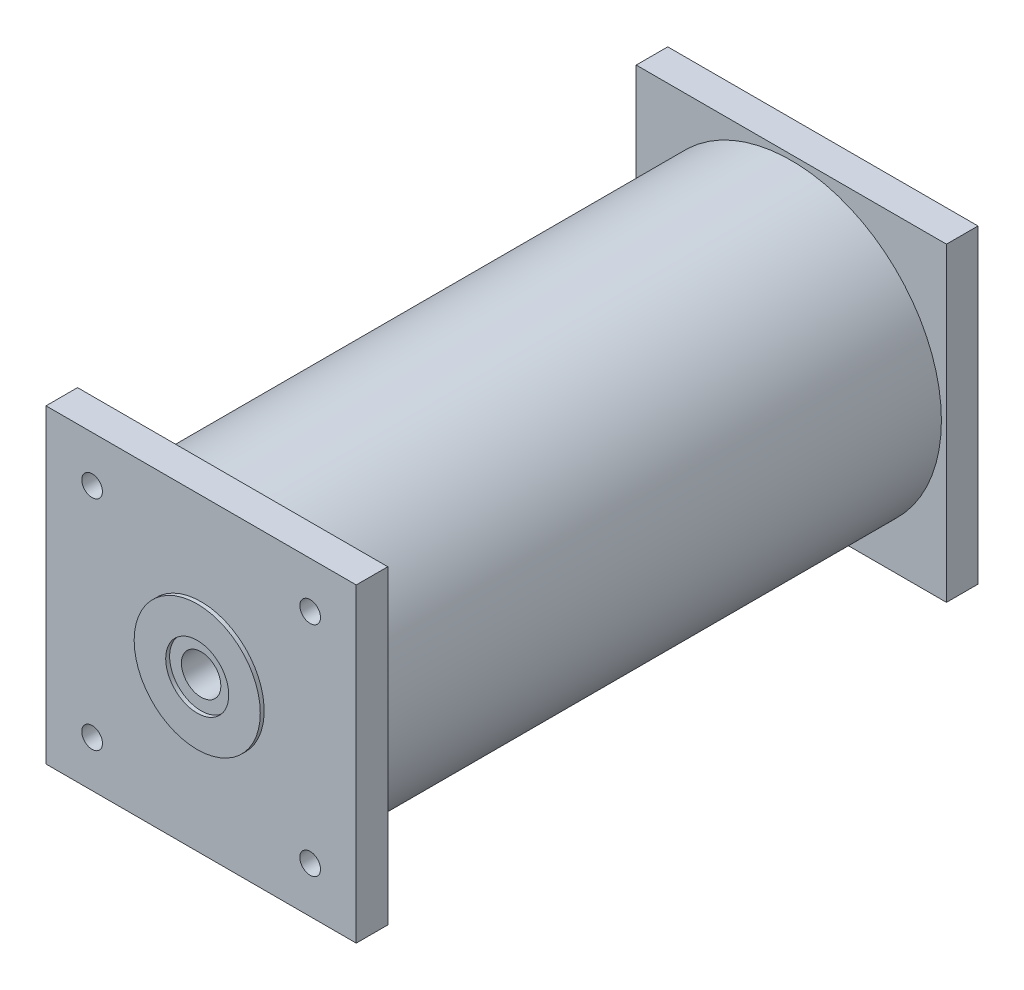
ISO-10303-21;
HEADER;
FILE_DESCRIPTION(('STEP AP214'),'2;1');
FILE_NAME('part.step','',(''),(''),'','','');
FILE_SCHEMA(('AUTOMOTIVE_DESIGN { 1 0 10303 214 1 1 1 1 }'));
ENDSEC;
DATA;
#1=APPLICATION_CONTEXT('core data for automotive mechanical design processes');
#2=APPLICATION_PROTOCOL_DEFINITION('international standard','automotive_design',2000,#1);
#3=PRODUCT_CONTEXT('',#1,'mechanical');
#4=PRODUCT('Part','Part','',(#3));
#5=PRODUCT_RELATED_PRODUCT_CATEGORY('part','',(#4));
#6=PRODUCT_DEFINITION_FORMATION('','',#4);
#7=PRODUCT_DEFINITION_CONTEXT('part definition',#1,'design');
#8=PRODUCT_DEFINITION('design','',#6,#7);
#9=PRODUCT_DEFINITION_SHAPE('','',#8);
#10=(LENGTH_UNIT() NAMED_UNIT(*) SI_UNIT(.MILLI.,.METRE.));
#11=(NAMED_UNIT(*) PLANE_ANGLE_UNIT() SI_UNIT($,.RADIAN.));
#12=(NAMED_UNIT(*) SI_UNIT($,.STERADIAN.) SOLID_ANGLE_UNIT());
#13=UNCERTAINTY_MEASURE_WITH_UNIT(LENGTH_MEASURE(1.E-05),#10,'distance_accuracy_value','');
#14=(GEOMETRIC_REPRESENTATION_CONTEXT(3) GLOBAL_UNCERTAINTY_ASSIGNED_CONTEXT((#13)) GLOBAL_UNIT_ASSIGNED_CONTEXT((#10,
#11,#12)) REPRESENTATION_CONTEXT('',''));
#15=CARTESIAN_POINT('',(0.,0.,0.));
#16=DIRECTION('',(0.,0.,1.));
#17=DIRECTION('',(1.,0.,0.));
#18=AXIS2_PLACEMENT_3D('',#15,#16,#17);
#19=CARTESIAN_POINT('',(-1.11022302462516E-13,0.,17.5882511339746));
#20=DIRECTION('',(0.,0.,1.));
#21=DIRECTION('',(1.,0.,0.));
#22=AXIS2_PLACEMENT_3D('',#19,#20,#21);
#23=CYLINDRICAL_SURFACE('',#22,30.225);
#24=CARTESIAN_POINT('',(1.11022302462516E-13,0.,-112.522));
#25=DIRECTION('',(0.,0.,1.));
#26=DIRECTION('',(1.,0.,0.));
#27=AXIS2_PLACEMENT_3D('',#24,#25,#26);
#28=CIRCLE('',#27,30.225);
#29=CARTESIAN_POINT('',(30.2250000000001,0.,-112.522));
#30=VERTEX_POINT('',#29);
#31=EDGE_CURVE('E166',#30,#30,#28,.T.);
#32=ORIENTED_EDGE('',*,*,#31,.T.);
#33=EDGE_LOOP('',(#32));
#34=FACE_BOUND('',#33,.T.);
#35=CARTESIAN_POINT('',(0.,0.,0.));
#36=DIRECTION('',(0.,0.,1.));
#37=DIRECTION('',(1.,0.,0.));
#38=AXIS2_PLACEMENT_3D('',#35,#36,#37);
#39=CIRCLE('',#38,30.225);
#40=CARTESIAN_POINT('',(19.9983707978787,-22.6630931346662,0.));
#41=VERTEX_POINT('',#40);
#42=CARTESIAN_POINT('',(22.6630931346659,-19.9983707978787,0.));
#43=VERTEX_POINT('',#42);
#44=EDGE_CURVE('E158',#41,#43,#39,.T.);
#45=ORIENTED_EDGE('',*,*,#44,.F.);
#46=CARTESIAN_POINT('',(-19.9983707978787,-22.6630931346662,0.));
#47=VERTEX_POINT('',#46);
#48=EDGE_CURVE('E163',#47,#41,#39,.T.);
#49=ORIENTED_EDGE('',*,*,#48,.F.);
#50=CARTESIAN_POINT('',(-22.6630931346664,-19.9983707978788,0.));
#51=VERTEX_POINT('',#50);
#52=EDGE_CURVE('E302',#51,#47,#39,.T.);
#53=ORIENTED_EDGE('',*,*,#52,.F.);
#54=CARTESIAN_POINT('',(-22.6630931346662,19.9983707978787,0.));
#55=VERTEX_POINT('',#54);
#56=EDGE_CURVE('E148',#55,#51,#39,.T.);
#57=ORIENTED_EDGE('',*,*,#56,.F.);
#58=CARTESIAN_POINT('',(-19.9983707978788,22.6630931346661,0.));
#59=VERTEX_POINT('',#58);
#60=EDGE_CURVE('E130',#59,#55,#39,.T.);
#61=ORIENTED_EDGE('',*,*,#60,.F.);
#62=CARTESIAN_POINT('',(19.9983707978787,22.6630931346661,0.));
#63=VERTEX_POINT('',#62);
#64=EDGE_CURVE('E146',#63,#59,#39,.T.);
#65=ORIENTED_EDGE('',*,*,#64,.F.);
#66=CARTESIAN_POINT('',(22.6630931346661,19.9983707978787,0.));
#67=VERTEX_POINT('',#66);
#68=EDGE_CURVE('E155',#67,#63,#39,.T.);
#69=ORIENTED_EDGE('',*,*,#68,.F.);
#70=EDGE_CURVE('E157',#43,#67,#39,.T.);
#71=ORIENTED_EDGE('',*,*,#70,.F.);
#72=EDGE_LOOP('',(#45,#49,#53,#57,#61,#65,#69,#71));
#73=FACE_BOUND('',#72,.T.);
#74=ADVANCED_FACE('F43',(#34,#73),#23,.T.);
#75=CARTESIAN_POINT('',(-1.11022302462516E-13,0.,6.35000000000005));
#76=DIRECTION('',(0.,0.,-1.));
#77=DIRECTION('',(-1.,0.,0.));
#78=AXIS2_PLACEMENT_3D('',#75,#76,#77);
#79=PLANE('',#78);
#80=CARTESIAN_POINT('',(-21.9583,-21.9583,6.34999999999997));
#81=DIRECTION('',(0.,0.,1.));
#82=DIRECTION('',(1.,0.,0.));
#83=AXIS2_PLACEMENT_3D('',#80,#81,#82);
#84=CIRCLE('',#83,2.0828);
#85=CARTESIAN_POINT('',(-19.8755,-21.9583,6.34999999999997));
#86=VERTEX_POINT('',#85);
#87=EDGE_CURVE('E196',#86,#86,#84,.T.);
#88=ORIENTED_EDGE('',*,*,#87,.F.);
#89=EDGE_LOOP('',(#88));
#90=FACE_BOUND('',#89,.T.);
#91=CARTESIAN_POINT('',(21.9583,21.9582999999999,6.34999999999994));
#92=DIRECTION('',(0.,0.,1.));
#93=DIRECTION('',(1.,0.,0.));
#94=AXIS2_PLACEMENT_3D('',#91,#92,#93);
#95=CIRCLE('',#94,2.0828);
#96=CARTESIAN_POINT('',(24.0411,21.9582999999999,6.34999999999994));
#97=VERTEX_POINT('',#96);
#98=EDGE_CURVE('E141',#97,#97,#95,.T.);
#99=ORIENTED_EDGE('',*,*,#98,.F.);
#100=EDGE_LOOP('',(#99));
#101=FACE_BOUND('',#100,.T.);
#102=CARTESIAN_POINT('',(-21.9583,21.9582999999999,6.34999999999991));
#103=DIRECTION('',(0.,0.,1.));
#104=DIRECTION('',(1.,0.,0.));
#105=AXIS2_PLACEMENT_3D('',#102,#103,#104);
#106=CIRCLE('',#105,2.0828);
#107=CARTESIAN_POINT('',(-19.8755,21.9582999999999,6.34999999999991));
#108=VERTEX_POINT('',#107);
#109=EDGE_CURVE('E133',#108,#108,#106,.T.);
#110=ORIENTED_EDGE('',*,*,#109,.F.);
#111=EDGE_LOOP('',(#110));
#112=FACE_BOUND('',#111,.T.);
#113=CARTESIAN_POINT('',(21.9583,-21.9583,6.34999999999999));
#114=DIRECTION('',(0.,0.,1.));
#115=DIRECTION('',(1.,0.,0.));
#116=AXIS2_PLACEMENT_3D('',#113,#114,#115);
#117=CIRCLE('',#116,2.0828);
#118=CARTESIAN_POINT('',(24.0411,-21.9583,6.34999999999999));
#119=VERTEX_POINT('',#118);
#120=EDGE_CURVE('E188',#119,#119,#117,.T.);
#121=ORIENTED_EDGE('',*,*,#120,.F.);
#122=EDGE_LOOP('',(#121));
#123=FACE_BOUND('',#122,.T.);
#124=CARTESIAN_POINT('',(-1.11022302462516E-13,0.,6.35000000000005));
#125=DIRECTION('',(0.,0.,-1.));
#126=DIRECTION('',(-1.,0.,0.));
#127=AXIS2_PLACEMENT_3D('',#124,#125,#126);
#128=CIRCLE('',#127,12.7);
#129=CARTESIAN_POINT('',(-12.7000000000001,0.,6.35000000000005));
#130=VERTEX_POINT('',#129);
#131=EDGE_CURVE('E162',#130,#130,#128,.F.);
#132=ORIENTED_EDGE('',*,*,#131,.F.);
#133=EDGE_LOOP('',(#132));
#134=FACE_BOUND('',#133,.T.);
#135=DIRECTION('',(0.,1.,0.));
#136=VECTOR('',#135,1.);
#137=CARTESIAN_POINT('',(31.2419999999999,-31.2420000000001,6.34999999999988));
#138=LINE('',#137,#136);
#139=CARTESIAN_POINT('',(31.2419999999999,-31.2420000000001,6.34999999999988));
#140=VERTEX_POINT('',#139);
#141=CARTESIAN_POINT('',(31.242,31.242,6.34999999999997));
#142=VERTEX_POINT('',#141);
#143=EDGE_CURVE('E271',#140,#142,#138,.T.);
#144=ORIENTED_EDGE('',*,*,#143,.T.);
#145=DIRECTION('',(-1.,0.,0.));
#146=VECTOR('',#145,1.);
#147=CARTESIAN_POINT('',(-31.2420000000001,31.242,6.34999999999997));
#148=LINE('',#147,#146);
#149=CARTESIAN_POINT('',(-31.2420000000001,31.242,6.34999999999997));
#150=VERTEX_POINT('',#149);
#151=EDGE_CURVE('E274',#142,#150,#148,.T.);
#152=ORIENTED_EDGE('',*,*,#151,.T.);
#153=DIRECTION('',(0.,-1.,0.));
#154=VECTOR('',#153,1.);
#155=CARTESIAN_POINT('',(-31.2420000000003,-31.2420000000001,6.34999999999999));
#156=LINE('',#155,#154);
#157=CARTESIAN_POINT('',(-31.2420000000003,-31.2420000000001,6.34999999999999));
#158=VERTEX_POINT('',#157);
#159=EDGE_CURVE('E277',#150,#158,#156,.T.);
#160=ORIENTED_EDGE('',*,*,#159,.T.);
#161=DIRECTION('',(1.,0.,0.));
#162=VECTOR('',#161,1.);
#163=CARTESIAN_POINT('',(-31.2420000000003,-31.2420000000001,6.34999999999999));
#164=LINE('',#163,#162);
#165=EDGE_CURVE('E279',#158,#140,#164,.T.);
#166=ORIENTED_EDGE('',*,*,#165,.T.);
#167=EDGE_LOOP('',(#144,#152,#160,#166));
#168=FACE_BOUND('',#167,.T.);
#169=ADVANCED_FACE('F313',(#90,#101,#112,#123,#134,#168),#79,.F.);
#170=CARTESIAN_POINT('',(0.,0.,0.));
#171=DIRECTION('',(0.,0.,-1.));
#172=DIRECTION('',(-1.,0.,0.));
#173=AXIS2_PLACEMENT_3D('',#170,#171,#172);
#174=PLANE('',#173);
#175=CARTESIAN_POINT('',(-21.9583,-21.9583,0.));
#176=DIRECTION('',(0.,0.,1.));
#177=DIRECTION('',(1.,0.,0.));
#178=AXIS2_PLACEMENT_3D('',#175,#176,#177);
#179=CIRCLE('',#178,2.0828);
#180=EDGE_CURVE('E208',#51,#47,#179,.T.);
#181=ORIENTED_EDGE('',*,*,#180,.T.);
#182=ORIENTED_EDGE('',*,*,#48,.T.);
#183=CARTESIAN_POINT('',(21.9582999999998,-21.9582999999999,0.));
#184=DIRECTION('',(0.,0.,-1.));
#185=DIRECTION('',(-1.,0.,0.));
#186=AXIS2_PLACEMENT_3D('',#183,#184,#185);
#187=CIRCLE('',#186,2.0828);
#188=EDGE_CURVE('E50',#43,#41,#187,.T.);
#189=ORIENTED_EDGE('',*,*,#188,.F.);
#190=ORIENTED_EDGE('',*,*,#70,.T.);
#191=CARTESIAN_POINT('',(21.9583,21.9582999999999,0.));
#192=DIRECTION('',(0.,0.,-1.));
#193=DIRECTION('',(-1.,0.,0.));
#194=AXIS2_PLACEMENT_3D('',#191,#192,#193);
#195=CIRCLE('',#194,2.0828);
#196=EDGE_CURVE('E11',#63,#67,#195,.T.);
#197=ORIENTED_EDGE('',*,*,#196,.F.);
#198=ORIENTED_EDGE('',*,*,#64,.T.);
#199=CARTESIAN_POINT('',(-21.9583,21.9583,0.));
#200=DIRECTION('',(0.,0.,1.));
#201=DIRECTION('',(1.,0.,0.));
#202=AXIS2_PLACEMENT_3D('',#199,#200,#201);
#203=CIRCLE('',#202,2.0828);
#204=EDGE_CURVE('E132',#59,#55,#203,.T.);
#205=ORIENTED_EDGE('',*,*,#204,.T.);
#206=ORIENTED_EDGE('',*,*,#56,.T.);
#207=EDGE_LOOP('',(#181,#182,#189,#190,#197,#198,#205,#206));
#208=FACE_BOUND('',#207,.T.);
#209=DIRECTION('',(0.,1.,0.));
#210=VECTOR('',#209,1.);
#211=CARTESIAN_POINT('',(31.2419999999999,-31.242,-1.38777878078145E-13));
#212=LINE('',#211,#210);
#213=CARTESIAN_POINT('',(31.2419999999999,-31.242,-1.38777878078145E-13));
#214=VERTEX_POINT('',#213);
#215=CARTESIAN_POINT('',(31.242,31.242,0.));
#216=VERTEX_POINT('',#215);
#217=EDGE_CURVE('E268',#214,#216,#212,.T.);
#218=ORIENTED_EDGE('',*,*,#217,.F.);
#219=DIRECTION('',(1.,0.,0.));
#220=VECTOR('',#219,1.);
#221=CARTESIAN_POINT('',(-31.2420000000001,-31.2420000000001,0.));
#222=LINE('',#221,#220);
#223=CARTESIAN_POINT('',(-31.2420000000001,-31.2420000000001,0.));
#224=VERTEX_POINT('',#223);
#225=EDGE_CURVE('E275',#224,#214,#222,.T.);
#226=ORIENTED_EDGE('',*,*,#225,.F.);
#227=DIRECTION('',(0.,-1.,0.));
#228=VECTOR('',#227,1.);
#229=CARTESIAN_POINT('',(-31.2420000000001,-31.2420000000001,0.));
#230=LINE('',#229,#228);
#231=CARTESIAN_POINT('',(-31.2420000000001,31.242,0.));
#232=VERTEX_POINT('',#231);
#233=EDGE_CURVE('E286',#232,#224,#230,.T.);
#234=ORIENTED_EDGE('',*,*,#233,.F.);
#235=DIRECTION('',(-1.,0.,0.));
#236=VECTOR('',#235,1.);
#237=CARTESIAN_POINT('',(-31.2420000000001,31.242,0.));
#238=LINE('',#237,#236);
#239=EDGE_CURVE('E284',#216,#232,#238,.T.);
#240=ORIENTED_EDGE('',*,*,#239,.F.);
#241=EDGE_LOOP('',(#218,#226,#234,#240));
#242=FACE_BOUND('',#241,.T.);
#243=ADVANCED_FACE('F152',(#208,#242),#174,.T.);
#244=CARTESIAN_POINT('',(31.2419999999999,-31.2420000000001,6.34999999999988));
#245=DIRECTION('',(-1.,0.,0.));
#246=DIRECTION('',(0.,0.,1.));
#247=AXIS2_PLACEMENT_3D('',#244,#245,#246);
#248=PLANE('',#247);
#249=ORIENTED_EDGE('',*,*,#217,.T.);
#250=DIRECTION('',(0.,0.,-1.));
#251=VECTOR('',#250,1.);
#252=CARTESIAN_POINT('',(31.242,31.242,6.34999999999997));
#253=LINE('',#252,#251);
#254=EDGE_CURVE('E164',#142,#216,#253,.T.);
#255=ORIENTED_EDGE('',*,*,#254,.F.);
#256=ORIENTED_EDGE('',*,*,#143,.F.);
#257=DIRECTION('',(0.,0.,-1.));
#258=VECTOR('',#257,1.);
#259=CARTESIAN_POINT('',(31.2419999999999,-31.2420000000001,6.34999999999988));
#260=LINE('',#259,#258);
#261=EDGE_CURVE('E281',#140,#214,#260,.T.);
#262=ORIENTED_EDGE('',*,*,#261,.T.);
#263=EDGE_LOOP('',(#249,#255,#256,#262));
#264=FACE_BOUND('',#263,.T.);
#265=ADVANCED_FACE('F385',(#264),#248,.F.);
#266=CARTESIAN_POINT('',(-31.2420000000001,31.242,6.34999999999997));
#267=DIRECTION('',(0.,-1.,0.));
#268=DIRECTION('',(0.,0.,-1.));
#269=AXIS2_PLACEMENT_3D('',#266,#267,#268);
#270=PLANE('',#269);
#271=ORIENTED_EDGE('',*,*,#239,.T.);
#272=DIRECTION('',(0.,0.,-1.));
#273=VECTOR('',#272,1.);
#274=CARTESIAN_POINT('',(-31.2420000000001,31.242,6.34999999999997));
#275=LINE('',#274,#273);
#276=EDGE_CURVE('E293',#150,#232,#275,.T.);
#277=ORIENTED_EDGE('',*,*,#276,.F.);
#278=ORIENTED_EDGE('',*,*,#151,.F.);
#279=ORIENTED_EDGE('',*,*,#254,.T.);
#280=EDGE_LOOP('',(#271,#277,#278,#279));
#281=FACE_BOUND('',#280,.T.);
#282=ADVANCED_FACE('F392',(#281),#270,.F.);
#283=CARTESIAN_POINT('',(-31.2420000000003,-31.2420000000001,6.34999999999999));
#284=DIRECTION('',(1.,0.,0.));
#285=DIRECTION('',(0.,0.,-1.));
#286=AXIS2_PLACEMENT_3D('',#283,#284,#285);
#287=PLANE('',#286);
#288=ORIENTED_EDGE('',*,*,#233,.T.);
#289=DIRECTION('',(0.,0.,-1.));
#290=VECTOR('',#289,1.);
#291=CARTESIAN_POINT('',(-31.2420000000003,-31.2420000000001,6.34999999999999));
#292=LINE('',#291,#290);
#293=EDGE_CURVE('E291',#158,#224,#292,.T.);
#294=ORIENTED_EDGE('',*,*,#293,.F.);
#295=ORIENTED_EDGE('',*,*,#159,.F.);
#296=ORIENTED_EDGE('',*,*,#276,.T.);
#297=EDGE_LOOP('',(#288,#294,#295,#296));
#298=FACE_BOUND('',#297,.T.);
#299=ADVANCED_FACE('F388',(#298),#287,.F.);
#300=CARTESIAN_POINT('',(-31.2420000000003,-31.2420000000001,6.34999999999999));
#301=DIRECTION('',(0.,1.,0.));
#302=DIRECTION('',(0.,0.,1.));
#303=AXIS2_PLACEMENT_3D('',#300,#301,#302);
#304=PLANE('',#303);
#305=CARTESIAN_POINT('',(-15.8750000000002,-31.2420000000001,3.17499999999993));
#306=DIRECTION('',(0.,-1.,0.));
#307=DIRECTION('',(0.,0.,-1.));
#308=AXIS2_PLACEMENT_3D('',#305,#306,#307);
#309=CIRCLE('',#308,2.0828);
#310=CARTESIAN_POINT('',(-15.8750000000002,-31.2420000000001,1.09219999999993));
#311=VERTEX_POINT('',#310);
#312=EDGE_CURVE('E225',#311,#311,#309,.T.);
#313=ORIENTED_EDGE('',*,*,#312,.F.);
#314=EDGE_LOOP('',(#313));
#315=FACE_BOUND('',#314,.T.);
#316=CARTESIAN_POINT('',(15.875,-31.242,3.17499999999998));
#317=DIRECTION('',(0.,-1.,0.));
#318=DIRECTION('',(0.,0.,-1.));
#319=AXIS2_PLACEMENT_3D('',#316,#317,#318);
#320=CIRCLE('',#319,2.0828);
#321=CARTESIAN_POINT('',(15.875,-31.242,1.09219999999998));
#322=VERTEX_POINT('',#321);
#323=EDGE_CURVE('E228',#322,#322,#320,.T.);
#324=ORIENTED_EDGE('',*,*,#323,.F.);
#325=EDGE_LOOP('',(#324));
#326=FACE_BOUND('',#325,.T.);
#327=ORIENTED_EDGE('',*,*,#225,.T.);
#328=ORIENTED_EDGE('',*,*,#261,.F.);
#329=ORIENTED_EDGE('',*,*,#165,.F.);
#330=ORIENTED_EDGE('',*,*,#293,.T.);
#331=EDGE_LOOP('',(#327,#328,#329,#330));
#332=FACE_BOUND('',#331,.T.);
#333=ADVANCED_FACE('F377',(#315,#326,#332),#304,.F.);
#334=CARTESIAN_POINT('',(0.,-1.11022302462516E-13,7.13740000000007));
#335=DIRECTION('',(0.,0.,-1.));
#336=DIRECTION('',(-1.,0.,0.));
#337=AXIS2_PLACEMENT_3D('',#334,#335,#336);
#338=CYLINDRICAL_SURFACE('',#337,12.7);
#339=CARTESIAN_POINT('',(0.,-1.11022302462516E-13,7.13740000000007));
#340=DIRECTION('',(0.,0.,1.));
#341=DIRECTION('',(1.,0.,0.));
#342=AXIS2_PLACEMENT_3D('',#339,#340,#341);
#343=CIRCLE('',#342,12.7);
#344=CARTESIAN_POINT('',(12.7,-1.11727294083153E-13,7.13740000000007));
#345=VERTEX_POINT('',#344);
#346=EDGE_CURVE('E175',#345,#345,#343,.T.);
#347=ORIENTED_EDGE('',*,*,#346,.F.);
#348=EDGE_LOOP('',(#347));
#349=FACE_BOUND('',#348,.T.);
#350=ORIENTED_EDGE('',*,*,#131,.T.);
#351=EDGE_LOOP('',(#350));
#352=FACE_BOUND('',#351,.T.);
#353=ADVANCED_FACE('F369',(#349,#352),#338,.T.);
#354=CARTESIAN_POINT('',(0.,-1.11022302462516E-13,7.13740000000007));
#355=DIRECTION('',(0.,0.,-1.));
#356=DIRECTION('',(-1.,0.,0.));
#357=AXIS2_PLACEMENT_3D('',#354,#355,#356);
#358=CYLINDRICAL_SURFACE('',#357,6.35);
#359=CARTESIAN_POINT('',(0.,-1.11022302462516E-13,7.13740000000007));
#360=DIRECTION('',(0.,0.,1.));
#361=DIRECTION('',(1.,0.,0.));
#362=AXIS2_PLACEMENT_3D('',#359,#360,#361);
#363=CIRCLE('',#362,6.35);
#364=CARTESIAN_POINT('',(6.35,-1.11374798272834E-13,7.13740000000007));
#365=VERTEX_POINT('',#364);
#366=EDGE_CURVE('E169',#365,#365,#363,.T.);
#367=ORIENTED_EDGE('',*,*,#366,.T.);
#368=EDGE_LOOP('',(#367));
#369=FACE_BOUND('',#368,.T.);
#370=CARTESIAN_POINT('',(-1.11022302462516E-13,0.,6.35000000000005));
#371=DIRECTION('',(0.,0.,-1.));
#372=DIRECTION('',(-1.,0.,0.));
#373=AXIS2_PLACEMENT_3D('',#370,#371,#372);
#374=CIRCLE('',#373,6.35);
#375=CARTESIAN_POINT('',(-6.35000000000011,0.,6.35000000000005));
#376=VERTEX_POINT('',#375);
#377=EDGE_CURVE('E171',#376,#376,#374,.F.);
#378=ORIENTED_EDGE('',*,*,#377,.F.);
#379=EDGE_LOOP('',(#378));
#380=FACE_BOUND('',#379,.T.);
#381=ADVANCED_FACE('F365',(#369,#380),#358,.F.);
#382=CARTESIAN_POINT('',(0.,-1.11022302462516E-13,7.13740000000007));
#383=DIRECTION('',(0.,0.,1.));
#384=DIRECTION('',(1.,0.,0.));
#385=AXIS2_PLACEMENT_3D('',#382,#383,#384);
#386=PLANE('',#385);
#387=ORIENTED_EDGE('',*,*,#346,.T.);
#388=EDGE_LOOP('',(#387));
#389=FACE_BOUND('',#388,.T.);
#390=ORIENTED_EDGE('',*,*,#366,.F.);
#391=EDGE_LOOP('',(#390));
#392=FACE_BOUND('',#391,.T.);
#393=ADVANCED_FACE('F368',(#389,#392),#386,.T.);
#394=CARTESIAN_POINT('',(0.,0.,0.));
#395=DIRECTION('',(0.,0.,1.));
#396=DIRECTION('',(1.,0.,0.));
#397=AXIS2_PLACEMENT_3D('',#394,#395,#396);
#398=PLANE('',#397);
#399=CARTESIAN_POINT('',(0.,0.,0.));
#400=DIRECTION('',(0.,0.,1.));
#401=DIRECTION('',(1.,0.,0.));
#402=AXIS2_PLACEMENT_3D('',#399,#400,#401);
#403=CIRCLE('',#402,3.96875);
#404=CARTESIAN_POINT('',(3.96875,0.,0.));
#405=VERTEX_POINT('',#404);
#406=EDGE_CURVE('E174',#405,#405,#403,.T.);
#407=ORIENTED_EDGE('',*,*,#406,.T.);
#408=EDGE_LOOP('',(#407));
#409=FACE_BOUND('',#408,.T.);
#410=ADVANCED_FACE('F373',(#409),#398,.T.);
#411=CARTESIAN_POINT('',(-1.11022302462516E-13,0.,6.35000000000005));
#412=DIRECTION('',(0.,0.,-1.));
#413=DIRECTION('',(-1.,0.,0.));
#414=AXIS2_PLACEMENT_3D('',#411,#412,#413);
#415=CYLINDRICAL_SURFACE('',#414,3.96875);
#416=CARTESIAN_POINT('',(-1.11022302462516E-13,0.,6.35000000000005));
#417=DIRECTION('',(0.,0.,1.));
#418=DIRECTION('',(1.,0.,0.));
#419=AXIS2_PLACEMENT_3D('',#416,#417,#418);
#420=CIRCLE('',#419,3.96875);
#421=CARTESIAN_POINT('',(3.96874999999989,0.,6.35000000000005));
#422=VERTEX_POINT('',#421);
#423=EDGE_CURVE('E265',#422,#422,#420,.T.);
#424=ORIENTED_EDGE('',*,*,#423,.T.);
#425=EDGE_LOOP('',(#424));
#426=FACE_BOUND('',#425,.T.);
#427=ORIENTED_EDGE('',*,*,#406,.F.);
#428=EDGE_LOOP('',(#427));
#429=FACE_BOUND('',#428,.T.);
#430=ADVANCED_FACE('F379',(#426,#429),#415,.F.);
#431=ORIENTED_EDGE('',*,*,#423,.F.);
#432=EDGE_LOOP('',(#431));
#433=FACE_BOUND('',#432,.T.);
#434=ORIENTED_EDGE('',*,*,#377,.T.);
#435=EDGE_LOOP('',(#434));
#436=FACE_BOUND('',#435,.T.);
#437=ADVANCED_FACE('F320',(#433,#436),#79,.F.);
#438=CARTESIAN_POINT('',(-31.2420000000001,-31.2420000000001,-118.872));
#439=DIRECTION('',(1.,0.,0.));
#440=DIRECTION('',(0.,0.,-1.));
#441=AXIS2_PLACEMENT_3D('',#438,#439,#440);
#442=PLANE('',#441);
#443=DIRECTION('',(0.,1.,0.));
#444=VECTOR('',#443,1.);
#445=CARTESIAN_POINT('',(-31.2419999999999,-31.242,-112.522));
#446=LINE('',#445,#444);
#447=CARTESIAN_POINT('',(-31.2419999999999,-31.242,-112.522));
#448=VERTEX_POINT('',#447);
#449=CARTESIAN_POINT('',(-31.2419999999999,31.242,-112.522));
#450=VERTEX_POINT('',#449);
#451=EDGE_CURVE('E224',#448,#450,#446,.T.);
#452=ORIENTED_EDGE('',*,*,#451,.T.);
#453=DIRECTION('',(0.,0.,1.));
#454=VECTOR('',#453,1.);
#455=CARTESIAN_POINT('',(-31.242,31.242,-118.872));
#456=LINE('',#455,#454);
#457=CARTESIAN_POINT('',(-31.242,31.242,-118.872));
#458=VERTEX_POINT('',#457);
#459=EDGE_CURVE('E170',#458,#450,#456,.T.);
#460=ORIENTED_EDGE('',*,*,#459,.F.);
#461=DIRECTION('',(0.,1.,0.));
#462=VECTOR('',#461,1.);
#463=CARTESIAN_POINT('',(-31.2420000000001,-31.2420000000001,-118.872));
#464=LINE('',#463,#462);
#465=CARTESIAN_POINT('',(-31.2420000000001,-31.2420000000001,-118.872));
#466=VERTEX_POINT('',#465);
#467=EDGE_CURVE('E233',#466,#458,#464,.T.);
#468=ORIENTED_EDGE('',*,*,#467,.F.);
#469=DIRECTION('',(0.,0.,1.));
#470=VECTOR('',#469,1.);
#471=CARTESIAN_POINT('',(-31.2420000000001,-31.2420000000001,-118.872));
#472=LINE('',#471,#470);
#473=EDGE_CURVE('E243',#466,#448,#472,.T.);
#474=ORIENTED_EDGE('',*,*,#473,.T.);
#475=EDGE_LOOP('',(#452,#460,#468,#474));
#476=FACE_BOUND('',#475,.T.);
#477=ADVANCED_FACE('F334',(#476),#442,.F.);
#478=CARTESIAN_POINT('',(31.2419999999999,31.2419999999999,-118.872));
#479=DIRECTION('',(0.,-1.,0.));
#480=DIRECTION('',(0.,0.,-1.));
#481=AXIS2_PLACEMENT_3D('',#478,#479,#480);
#482=PLANE('',#481);
#483=DIRECTION('',(1.,0.,0.));
#484=VECTOR('',#483,1.);
#485=CARTESIAN_POINT('',(31.2419999999999,31.2419999999999,-112.522));
#486=LINE('',#485,#484);
#487=CARTESIAN_POINT('',(31.2419999999999,31.2419999999999,-112.522));
#488=VERTEX_POINT('',#487);
#489=EDGE_CURVE('E246',#450,#488,#486,.T.);
#490=ORIENTED_EDGE('',*,*,#489,.T.);
#491=DIRECTION('',(0.,0.,1.));
#492=VECTOR('',#491,1.);
#493=CARTESIAN_POINT('',(31.2419999999999,31.2419999999999,-118.872));
#494=LINE('',#493,#492);
#495=CARTESIAN_POINT('',(31.2419999999999,31.2419999999999,-118.872));
#496=VERTEX_POINT('',#495);
#497=EDGE_CURVE('E256',#496,#488,#494,.T.);
#498=ORIENTED_EDGE('',*,*,#497,.F.);
#499=DIRECTION('',(1.,0.,0.));
#500=VECTOR('',#499,1.);
#501=CARTESIAN_POINT('',(31.2419999999999,31.2419999999999,-118.872));
#502=LINE('',#501,#500);
#503=EDGE_CURVE('E236',#458,#496,#502,.T.);
#504=ORIENTED_EDGE('',*,*,#503,.F.);
#505=ORIENTED_EDGE('',*,*,#459,.T.);
#506=EDGE_LOOP('',(#490,#498,#504,#505));
#507=FACE_BOUND('',#506,.T.);
#508=ADVANCED_FACE('F346',(#507),#482,.F.);
#509=CARTESIAN_POINT('',(31.2419999999999,-31.2419999999999,-118.872));
#510=DIRECTION('',(-1.,0.,0.));
#511=DIRECTION('',(0.,0.,1.));
#512=AXIS2_PLACEMENT_3D('',#509,#510,#511);
#513=PLANE('',#512);
#514=DIRECTION('',(0.,-1.,0.));
#515=VECTOR('',#514,1.);
#516=CARTESIAN_POINT('',(31.2419999999999,-31.242,-112.522));
#517=LINE('',#516,#515);
#518=CARTESIAN_POINT('',(31.2419999999999,-31.242,-112.522));
#519=VERTEX_POINT('',#518);
#520=EDGE_CURVE('E248',#488,#519,#517,.T.);
#521=ORIENTED_EDGE('',*,*,#520,.T.);
#522=DIRECTION('',(0.,0.,1.));
#523=VECTOR('',#522,1.);
#524=CARTESIAN_POINT('',(31.2419999999999,-31.2419999999999,-118.872));
#525=LINE('',#524,#523);
#526=CARTESIAN_POINT('',(31.2419999999999,-31.2419999999999,-118.872));
#527=VERTEX_POINT('',#526);
#528=EDGE_CURVE('E253',#527,#519,#525,.T.);
#529=ORIENTED_EDGE('',*,*,#528,.F.);
#530=DIRECTION('',(0.,-1.,0.));
#531=VECTOR('',#530,1.);
#532=CARTESIAN_POINT('',(31.2419999999999,-31.2419999999999,-118.872));
#533=LINE('',#532,#531);
#534=EDGE_CURVE('E239',#496,#527,#533,.T.);
#535=ORIENTED_EDGE('',*,*,#534,.F.);
#536=ORIENTED_EDGE('',*,*,#497,.T.);
#537=EDGE_LOOP('',(#521,#529,#535,#536));
#538=FACE_BOUND('',#537,.T.);
#539=ADVANCED_FACE('F343',(#538),#513,.F.);
#540=CARTESIAN_POINT('',(31.2419999999999,-31.2419999999999,-118.872));
#541=DIRECTION('',(0.,1.,0.));
#542=DIRECTION('',(0.,0.,1.));
#543=AXIS2_PLACEMENT_3D('',#540,#541,#542);
#544=PLANE('',#543);
#545=CARTESIAN_POINT('',(-15.8750000000002,-31.242,-115.697));
#546=DIRECTION('',(0.,-1.,0.));
#547=DIRECTION('',(0.,0.,-1.));
#548=AXIS2_PLACEMENT_3D('',#545,#546,#547);
#549=CIRCLE('',#548,2.0828);
#550=CARTESIAN_POINT('',(-15.8750000000002,-31.242,-117.7798));
#551=VERTEX_POINT('',#550);
#552=EDGE_CURVE('E213',#551,#551,#549,.T.);
#553=ORIENTED_EDGE('',*,*,#552,.F.);
#554=EDGE_LOOP('',(#553));
#555=FACE_BOUND('',#554,.T.);
#556=CARTESIAN_POINT('',(15.875,-31.242,-115.697));
#557=DIRECTION('',(0.,-1.,0.));
#558=DIRECTION('',(0.,0.,-1.));
#559=AXIS2_PLACEMENT_3D('',#556,#557,#558);
#560=CIRCLE('',#559,2.0828);
#561=CARTESIAN_POINT('',(15.875,-31.242,-117.7798));
#562=VERTEX_POINT('',#561);
#563=EDGE_CURVE('E187',#562,#562,#560,.T.);
#564=ORIENTED_EDGE('',*,*,#563,.F.);
#565=EDGE_LOOP('',(#564));
#566=FACE_BOUND('',#565,.T.);
#567=DIRECTION('',(-1.,0.,0.));
#568=VECTOR('',#567,1.);
#569=CARTESIAN_POINT('',(31.2419999999999,-31.242,-112.522));
#570=LINE('',#569,#568);
#571=EDGE_CURVE('E237',#519,#448,#570,.T.);
#572=ORIENTED_EDGE('',*,*,#571,.T.);
#573=ORIENTED_EDGE('',*,*,#473,.F.);
#574=DIRECTION('',(-1.,0.,0.));
#575=VECTOR('',#574,1.);
#576=CARTESIAN_POINT('',(31.2419999999999,-31.2419999999999,-118.872));
#577=LINE('',#576,#575);
#578=EDGE_CURVE('E241',#527,#466,#577,.T.);
#579=ORIENTED_EDGE('',*,*,#578,.F.);
#580=ORIENTED_EDGE('',*,*,#528,.T.);
#581=EDGE_LOOP('',(#572,#573,#579,#580));
#582=FACE_BOUND('',#581,.T.);
#583=ADVANCED_FACE('F339',(#555,#566,#582),#544,.F.);
#584=CARTESIAN_POINT('',(-1.11022302462516E-13,0.,-118.872));
#585=DIRECTION('',(0.,0.,1.));
#586=DIRECTION('',(1.,0.,0.));
#587=AXIS2_PLACEMENT_3D('',#584,#585,#586);
#588=PLANE('',#587);
#589=ORIENTED_EDGE('',*,*,#467,.T.);
#590=ORIENTED_EDGE('',*,*,#503,.T.);
#591=ORIENTED_EDGE('',*,*,#534,.T.);
#592=ORIENTED_EDGE('',*,*,#578,.T.);
#593=EDGE_LOOP('',(#589,#590,#591,#592));
#594=FACE_BOUND('',#593,.T.);
#595=ADVANCED_FACE('F327',(#594),#588,.F.);
#596=CARTESIAN_POINT('',(-1.11022302462516E-13,0.,-112.522));
#597=DIRECTION('',(0.,0.,1.));
#598=DIRECTION('',(1.,0.,0.));
#599=AXIS2_PLACEMENT_3D('',#596,#597,#598);
#600=PLANE('',#599);
#601=ORIENTED_EDGE('',*,*,#31,.F.);
#602=EDGE_LOOP('',(#601));
#603=FACE_BOUND('',#602,.T.);
#604=ORIENTED_EDGE('',*,*,#451,.F.);
#605=ORIENTED_EDGE('',*,*,#571,.F.);
#606=ORIENTED_EDGE('',*,*,#520,.F.);
#607=ORIENTED_EDGE('',*,*,#489,.F.);
#608=EDGE_LOOP('',(#604,#605,#606,#607));
#609=FACE_BOUND('',#608,.T.);
#610=ADVANCED_FACE('F323',(#603,#609),#600,.T.);
#611=CARTESIAN_POINT('',(15.875,-22.987,3.17499999999993));
#612=DIRECTION('',(0.,-1.,0.));
#613=DIRECTION('',(0.,0.,-1.));
#614=AXIS2_PLACEMENT_3D('',#611,#612,#613);
#615=CYLINDRICAL_SURFACE('',#614,2.0828);
#616=CARTESIAN_POINT('',(15.875,-22.987,3.17499999999993));
#617=DIRECTION('',(0.,-1.,0.));
#618=DIRECTION('',(0.,0.,-1.));
#619=AXIS2_PLACEMENT_3D('',#616,#617,#618);
#620=CIRCLE('',#619,2.0828);
#621=CARTESIAN_POINT('',(15.875,-22.987,1.09219999999993));
#622=VERTEX_POINT('',#621);
#623=EDGE_CURVE('E212',#622,#622,#620,.T.);
#624=ORIENTED_EDGE('',*,*,#623,.F.);
#625=EDGE_LOOP('',(#624));
#626=FACE_BOUND('',#625,.T.);
#627=ORIENTED_EDGE('',*,*,#323,.T.);
#628=EDGE_LOOP('',(#627));
#629=FACE_BOUND('',#628,.T.);
#630=ADVANCED_FACE('F326',(#626,#629),#615,.F.);
#631=CARTESIAN_POINT('',(15.875,-22.987,3.17499999999993));
#632=DIRECTION('',(0.,-1.,0.));
#633=DIRECTION('',(0.,0.,-1.));
#634=AXIS2_PLACEMENT_3D('',#631,#632,#633);
#635=PLANE('',#634);
#636=ORIENTED_EDGE('',*,*,#623,.T.);
#637=EDGE_LOOP('',(#636));
#638=FACE_BOUND('',#637,.T.);
#639=ADVANCED_FACE('F356',(#638),#635,.T.);
#640=CARTESIAN_POINT('',(-15.875,-22.987,3.17500000000001));
#641=DIRECTION('',(0.,-1.,0.));
#642=DIRECTION('',(0.,0.,-1.));
#643=AXIS2_PLACEMENT_3D('',#640,#641,#642);
#644=CYLINDRICAL_SURFACE('',#643,2.0828);
#645=CARTESIAN_POINT('',(-15.875,-22.987,3.17500000000001));
#646=DIRECTION('',(0.,-1.,0.));
#647=DIRECTION('',(0.,0.,-1.));
#648=AXIS2_PLACEMENT_3D('',#645,#646,#647);
#649=CIRCLE('',#648,2.0828);
#650=CARTESIAN_POINT('',(-15.875,-22.987,1.09220000000001));
#651=VERTEX_POINT('',#650);
#652=EDGE_CURVE('E221',#651,#651,#649,.T.);
#653=ORIENTED_EDGE('',*,*,#652,.F.);
#654=EDGE_LOOP('',(#653));
#655=FACE_BOUND('',#654,.T.);
#656=ORIENTED_EDGE('',*,*,#312,.T.);
#657=EDGE_LOOP('',(#656));
#658=FACE_BOUND('',#657,.T.);
#659=ADVANCED_FACE('F467',(#655,#658),#644,.F.);
#660=CARTESIAN_POINT('',(-15.875,-22.987,3.17500000000001));
#661=DIRECTION('',(0.,-1.,0.));
#662=DIRECTION('',(0.,0.,-1.));
#663=AXIS2_PLACEMENT_3D('',#660,#661,#662);
#664=PLANE('',#663);
#665=ORIENTED_EDGE('',*,*,#652,.T.);
#666=EDGE_LOOP('',(#665));
#667=FACE_BOUND('',#666,.T.);
#668=ADVANCED_FACE('F476',(#667),#664,.T.);
#669=CARTESIAN_POINT('',(15.875,-22.9869999999999,-115.697));
#670=DIRECTION('',(0.,-1.,0.));
#671=DIRECTION('',(0.,0.,-1.));
#672=AXIS2_PLACEMENT_3D('',#669,#670,#671);
#673=CYLINDRICAL_SURFACE('',#672,2.0828);
#674=CARTESIAN_POINT('',(15.875,-22.9869999999999,-115.697));
#675=DIRECTION('',(0.,-1.,0.));
#676=DIRECTION('',(0.,0.,-1.));
#677=AXIS2_PLACEMENT_3D('',#674,#675,#676);
#678=CIRCLE('',#677,2.0828);
#679=CARTESIAN_POINT('',(15.875,-22.9869999999999,-117.7798));
#680=VERTEX_POINT('',#679);
#681=EDGE_CURVE('E216',#680,#680,#678,.T.);
#682=ORIENTED_EDGE('',*,*,#681,.F.);
#683=EDGE_LOOP('',(#682));
#684=FACE_BOUND('',#683,.T.);
#685=ORIENTED_EDGE('',*,*,#563,.T.);
#686=EDGE_LOOP('',(#685));
#687=FACE_BOUND('',#686,.T.);
#688=ADVANCED_FACE('F486',(#684,#687),#673,.F.);
#689=CARTESIAN_POINT('',(15.875,-22.9869999999999,-115.697));
#690=DIRECTION('',(0.,-1.,0.));
#691=DIRECTION('',(0.,0.,-1.));
#692=AXIS2_PLACEMENT_3D('',#689,#690,#691);
#693=PLANE('',#692);
#694=ORIENTED_EDGE('',*,*,#681,.T.);
#695=EDGE_LOOP('',(#694));
#696=FACE_BOUND('',#695,.T.);
#697=ADVANCED_FACE('F496',(#696),#693,.T.);
#698=CARTESIAN_POINT('',(-15.875,-22.987,-115.697));
#699=DIRECTION('',(0.,-1.,0.));
#700=DIRECTION('',(0.,0.,-1.));
#701=AXIS2_PLACEMENT_3D('',#698,#699,#700);
#702=CYLINDRICAL_SURFACE('',#701,2.0828);
#703=CARTESIAN_POINT('',(-15.875,-22.987,-115.697));
#704=DIRECTION('',(0.,-1.,0.));
#705=DIRECTION('',(0.,0.,-1.));
#706=AXIS2_PLACEMENT_3D('',#703,#704,#705);
#707=CIRCLE('',#706,2.0828);
#708=CARTESIAN_POINT('',(-15.875,-22.987,-117.7798));
#709=VERTEX_POINT('',#708);
#710=EDGE_CURVE('E209',#709,#709,#707,.T.);
#711=ORIENTED_EDGE('',*,*,#710,.F.);
#712=EDGE_LOOP('',(#711));
#713=FACE_BOUND('',#712,.T.);
#714=ORIENTED_EDGE('',*,*,#552,.T.);
#715=EDGE_LOOP('',(#714));
#716=FACE_BOUND('',#715,.T.);
#717=ADVANCED_FACE('F506',(#713,#716),#702,.F.);
#718=CARTESIAN_POINT('',(-15.875,-22.987,-115.697));
#719=DIRECTION('',(0.,-1.,0.));
#720=DIRECTION('',(0.,0.,-1.));
#721=AXIS2_PLACEMENT_3D('',#718,#719,#720);
#722=PLANE('',#721);
#723=ORIENTED_EDGE('',*,*,#710,.T.);
#724=EDGE_LOOP('',(#723));
#725=FACE_BOUND('',#724,.T.);
#726=ADVANCED_FACE('F516',(#725),#722,.T.);
#727=CARTESIAN_POINT('',(21.9582999999998,-21.9582999999999,0.));
#728=DIRECTION('',(0.,0.,1.));
#729=DIRECTION('',(1.,0.,0.));
#730=AXIS2_PLACEMENT_3D('',#727,#728,#729);
#731=CYLINDRICAL_SURFACE('',#730,2.0828);
#732=CARTESIAN_POINT('',(21.9582999999998,-21.9582999999999,0.));
#733=DIRECTION('',(0.,0.,1.));
#734=DIRECTION('',(1.,0.,0.));
#735=AXIS2_PLACEMENT_3D('',#732,#733,#734);
#736=CIRCLE('',#735,2.0828);
#737=EDGE_CURVE('E183',#43,#41,#736,.T.);
#738=ORIENTED_EDGE('',*,*,#737,.F.);
#739=ORIENTED_EDGE('',*,*,#188,.T.);
#740=EDGE_LOOP('',(#738,#739));
#741=FACE_BOUND('',#740,.T.);
#742=ORIENTED_EDGE('',*,*,#120,.T.);
#743=EDGE_LOOP('',(#742));
#744=FACE_BOUND('',#743,.T.);
#745=ADVANCED_FACE('F181',(#741,#744),#731,.F.);
#746=CARTESIAN_POINT('',(21.9582999999998,-21.9582999999999,0.));
#747=DIRECTION('',(0.,0.,1.));
#748=DIRECTION('',(1.,0.,0.));
#749=AXIS2_PLACEMENT_3D('',#746,#747,#748);
#750=PLANE('',#749);
#751=ORIENTED_EDGE('',*,*,#737,.T.);
#752=ORIENTED_EDGE('',*,*,#44,.T.);
#753=EDGE_LOOP('',(#751,#752));
#754=FACE_BOUND('',#753,.T.);
#755=ADVANCED_FACE('F186',(#754),#750,.T.);
#756=CARTESIAN_POINT('',(-21.9583,21.9583,0.));
#757=DIRECTION('',(0.,0.,1.));
#758=DIRECTION('',(1.,0.,0.));
#759=AXIS2_PLACEMENT_3D('',#756,#757,#758);
#760=CYLINDRICAL_SURFACE('',#759,2.0828);
#761=ORIENTED_EDGE('',*,*,#204,.F.);
#762=EDGE_CURVE('E63',#55,#59,#203,.T.);
#763=ORIENTED_EDGE('',*,*,#762,.F.);
#764=EDGE_LOOP('',(#761,#763));
#765=FACE_BOUND('',#764,.T.);
#766=ORIENTED_EDGE('',*,*,#109,.T.);
#767=EDGE_LOOP('',(#766));
#768=FACE_BOUND('',#767,.T.);
#769=ADVANCED_FACE('F135',(#765,#768),#760,.F.);
#770=CARTESIAN_POINT('',(-21.9583,21.9583,0.));
#771=DIRECTION('',(0.,0.,1.));
#772=DIRECTION('',(1.,0.,0.));
#773=AXIS2_PLACEMENT_3D('',#770,#771,#772);
#774=PLANE('',#773);
#775=ORIENTED_EDGE('',*,*,#762,.T.);
#776=ORIENTED_EDGE('',*,*,#60,.T.);
#777=EDGE_LOOP('',(#775,#776));
#778=FACE_BOUND('',#777,.T.);
#779=ADVANCED_FACE('F128',(#778),#774,.T.);
#780=CARTESIAN_POINT('',(21.9583,21.9582999999999,0.));
#781=DIRECTION('',(0.,0.,1.));
#782=DIRECTION('',(1.,0.,0.));
#783=AXIS2_PLACEMENT_3D('',#780,#781,#782);
#784=CYLINDRICAL_SURFACE('',#783,2.0828);
#785=CARTESIAN_POINT('',(21.9583,21.9582999999999,0.));
#786=DIRECTION('',(0.,0.,1.));
#787=DIRECTION('',(1.,0.,0.));
#788=AXIS2_PLACEMENT_3D('',#785,#786,#787);
#789=CIRCLE('',#788,2.0828);
#790=EDGE_CURVE('E194',#63,#67,#789,.T.);
#791=ORIENTED_EDGE('',*,*,#790,.F.);
#792=ORIENTED_EDGE('',*,*,#196,.T.);
#793=EDGE_LOOP('',(#791,#792));
#794=FACE_BOUND('',#793,.T.);
#795=ORIENTED_EDGE('',*,*,#98,.T.);
#796=EDGE_LOOP('',(#795));
#797=FACE_BOUND('',#796,.T.);
#798=ADVANCED_FACE('F559',(#794,#797),#784,.F.);
#799=CARTESIAN_POINT('',(21.9583,21.9582999999999,0.));
#800=DIRECTION('',(0.,0.,1.));
#801=DIRECTION('',(1.,0.,0.));
#802=AXIS2_PLACEMENT_3D('',#799,#800,#801);
#803=PLANE('',#802);
#804=ORIENTED_EDGE('',*,*,#790,.T.);
#805=ORIENTED_EDGE('',*,*,#68,.T.);
#806=EDGE_LOOP('',(#804,#805));
#807=FACE_BOUND('',#806,.T.);
#808=ADVANCED_FACE('F193',(#807),#803,.T.);
#809=CARTESIAN_POINT('',(-21.9583,-21.9583,0.));
#810=DIRECTION('',(0.,0.,1.));
#811=DIRECTION('',(1.,0.,0.));
#812=AXIS2_PLACEMENT_3D('',#809,#810,#811);
#813=CYLINDRICAL_SURFACE('',#812,2.0828);
#814=ORIENTED_EDGE('',*,*,#180,.F.);
#815=EDGE_CURVE('E56',#47,#51,#179,.T.);
#816=ORIENTED_EDGE('',*,*,#815,.F.);
#817=EDGE_LOOP('',(#814,#816));
#818=FACE_BOUND('',#817,.T.);
#819=ORIENTED_EDGE('',*,*,#87,.T.);
#820=EDGE_LOOP('',(#819));
#821=FACE_BOUND('',#820,.T.);
#822=ADVANCED_FACE('F306',(#818,#821),#813,.F.);
#823=CARTESIAN_POINT('',(-21.9583,-21.9583,0.));
#824=DIRECTION('',(0.,0.,1.));
#825=DIRECTION('',(1.,0.,0.));
#826=AXIS2_PLACEMENT_3D('',#823,#824,#825);
#827=PLANE('',#826);
#828=ORIENTED_EDGE('',*,*,#815,.T.);
#829=ORIENTED_EDGE('',*,*,#52,.T.);
#830=EDGE_LOOP('',(#828,#829));
#831=FACE_BOUND('',#830,.T.);
#832=ADVANCED_FACE('F304',(#831),#827,.T.);
#833=CLOSED_SHELL('',(#74,#169,#243,#265,#282,#299,#333,#353,#381,#393,#410,#430,#437,#477,#508,
#539,#583,#595,#610,#630,#639,#659,#668,#688,#697,#717,#726,#745,#755,#769,#779,#798,#808,#822,#832));
#834=MANIFOLD_SOLID_BREP('B2',#833);
#835=ADVANCED_BREP_SHAPE_REPRESENTATION('',(#18,#834),#14);
#836=SHAPE_DEFINITION_REPRESENTATION(#9,#835);
ENDSEC;
END-ISO-10303-21;
